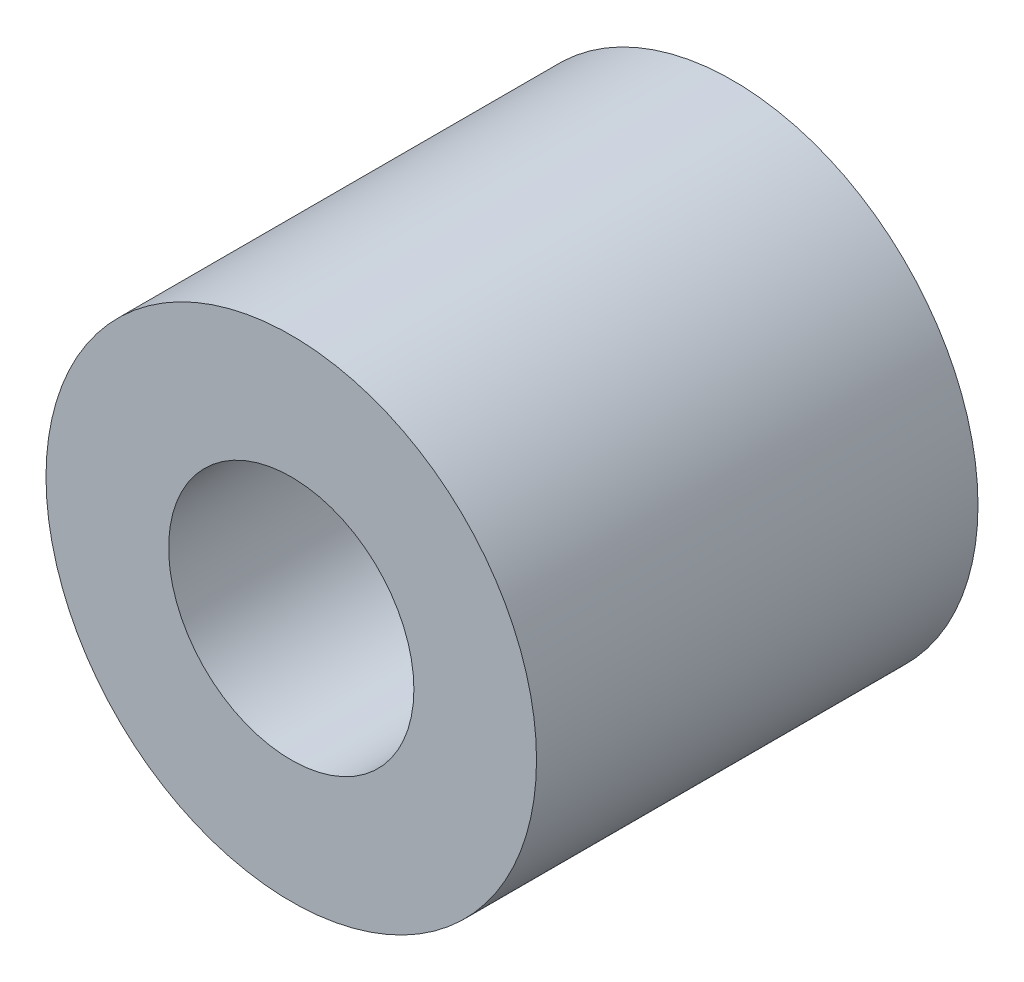
ISO-10303-21;
HEADER;
FILE_DESCRIPTION(('STEP AP214'),'2;1');
FILE_NAME('part.step','',(''),(''),'','','');
FILE_SCHEMA(('AUTOMOTIVE_DESIGN { 1 0 10303 214 1 1 1 1 }'));
ENDSEC;
DATA;
#1=APPLICATION_CONTEXT('core data for automotive mechanical design processes');
#2=APPLICATION_PROTOCOL_DEFINITION('international standard','automotive_design',2000,#1);
#3=PRODUCT_CONTEXT('',#1,'mechanical');
#4=PRODUCT('Part','Part','',(#3));
#5=PRODUCT_RELATED_PRODUCT_CATEGORY('part','',(#4));
#6=PRODUCT_DEFINITION_FORMATION('','',#4);
#7=PRODUCT_DEFINITION_CONTEXT('part definition',#1,'design');
#8=PRODUCT_DEFINITION('design','',#6,#7);
#9=PRODUCT_DEFINITION_SHAPE('','',#8);
#10=(LENGTH_UNIT() NAMED_UNIT(*) SI_UNIT(.MILLI.,.METRE.));
#11=(NAMED_UNIT(*) PLANE_ANGLE_UNIT() SI_UNIT($,.RADIAN.));
#12=(NAMED_UNIT(*) SI_UNIT($,.STERADIAN.) SOLID_ANGLE_UNIT());
#13=UNCERTAINTY_MEASURE_WITH_UNIT(LENGTH_MEASURE(1.E-05),#10,'distance_accuracy_value','');
#14=(GEOMETRIC_REPRESENTATION_CONTEXT(3) GLOBAL_UNCERTAINTY_ASSIGNED_CONTEXT((#13)) GLOBAL_UNIT_ASSIGNED_CONTEXT((#10,
#11,#12)) REPRESENTATION_CONTEXT('',''));
#15=CARTESIAN_POINT('',(0.,0.,0.));
#16=DIRECTION('',(0.,0.,1.));
#17=DIRECTION('',(1.,0.,0.));
#18=AXIS2_PLACEMENT_3D('',#15,#16,#17);
#19=CARTESIAN_POINT('',(0.,0.,9.));
#20=DIRECTION('',(0.,0.,1.));
#21=DIRECTION('',(1.,0.,0.));
#22=AXIS2_PLACEMENT_3D('',#19,#20,#21);
#23=PLANE('',#22);
#24=CARTESIAN_POINT('',(0.,0.,9.));
#25=DIRECTION('',(0.,0.,1.));
#26=DIRECTION('',(1.,0.,0.));
#27=AXIS2_PLACEMENT_3D('',#24,#25,#26);
#28=CIRCLE('',#27,5.);
#29=CARTESIAN_POINT('',(5.,0.,9.));
#30=VERTEX_POINT('',#29);
#31=EDGE_CURVE('E10',#30,#30,#28,.T.);
#32=ORIENTED_EDGE('',*,*,#31,.T.);
#33=EDGE_LOOP('',(#32));
#34=FACE_BOUND('',#33,.T.);
#35=CARTESIAN_POINT('',(0.,0.,9.));
#36=DIRECTION('',(0.,0.,1.));
#37=DIRECTION('',(1.,0.,0.));
#38=AXIS2_PLACEMENT_3D('',#35,#36,#37);
#39=CIRCLE('',#38,2.5);
#40=CARTESIAN_POINT('',(2.5,0.,9.));
#41=VERTEX_POINT('',#40);
#42=EDGE_CURVE('E48',#41,#41,#39,.T.);
#43=ORIENTED_EDGE('',*,*,#42,.F.);
#44=EDGE_LOOP('',(#43));
#45=FACE_BOUND('',#44,.T.);
#46=ADVANCED_FACE('F37',(#34,#45),#23,.T.);
#47=CARTESIAN_POINT('',(0.,0.,0.));
#48=DIRECTION('',(0.,0.,1.));
#49=DIRECTION('',(1.,0.,0.));
#50=AXIS2_PLACEMENT_3D('',#47,#48,#49);
#51=PLANE('',#50);
#52=CARTESIAN_POINT('',(0.,0.,0.));
#53=DIRECTION('',(0.,0.,1.));
#54=DIRECTION('',(1.,0.,0.));
#55=AXIS2_PLACEMENT_3D('',#52,#53,#54);
#56=CIRCLE('',#55,5.);
#57=CARTESIAN_POINT('',(5.,0.,0.));
#58=VERTEX_POINT('',#57);
#59=EDGE_CURVE('E41',#58,#58,#56,.T.);
#60=ORIENTED_EDGE('',*,*,#59,.F.);
#61=EDGE_LOOP('',(#60));
#62=FACE_BOUND('',#61,.T.);
#63=CARTESIAN_POINT('',(0.,0.,0.));
#64=DIRECTION('',(0.,0.,1.));
#65=DIRECTION('',(1.,0.,0.));
#66=AXIS2_PLACEMENT_3D('',#63,#64,#65);
#67=CIRCLE('',#66,2.5);
#68=CARTESIAN_POINT('',(2.5,0.,0.));
#69=VERTEX_POINT('',#68);
#70=EDGE_CURVE('E50',#69,#69,#67,.T.);
#71=ORIENTED_EDGE('',*,*,#70,.T.);
#72=EDGE_LOOP('',(#71));
#73=FACE_BOUND('',#72,.T.);
#74=ADVANCED_FACE('F60',(#62,#73),#51,.F.);
#75=CARTESIAN_POINT('',(0.,0.,9.));
#76=DIRECTION('',(0.,0.,-1.));
#77=DIRECTION('',(-1.,0.,0.));
#78=AXIS2_PLACEMENT_3D('',#75,#76,#77);
#79=CYLINDRICAL_SURFACE('',#78,5.);
#80=ORIENTED_EDGE('',*,*,#31,.F.);
#81=EDGE_LOOP('',(#80));
#82=FACE_BOUND('',#81,.T.);
#83=ORIENTED_EDGE('',*,*,#59,.T.);
#84=EDGE_LOOP('',(#83));
#85=FACE_BOUND('',#84,.T.);
#86=ADVANCED_FACE('F39',(#82,#85),#79,.T.);
#87=CARTESIAN_POINT('',(0.,0.,9.));
#88=DIRECTION('',(0.,0.,-1.));
#89=DIRECTION('',(-1.,0.,0.));
#90=AXIS2_PLACEMENT_3D('',#87,#88,#89);
#91=CYLINDRICAL_SURFACE('',#90,2.5);
#92=ORIENTED_EDGE('',*,*,#42,.T.);
#93=EDGE_LOOP('',(#92));
#94=FACE_BOUND('',#93,.T.);
#95=ORIENTED_EDGE('',*,*,#70,.F.);
#96=EDGE_LOOP('',(#95));
#97=FACE_BOUND('',#96,.T.);
#98=ADVANCED_FACE('F56',(#94,#97),#91,.F.);
#99=CLOSED_SHELL('',(#46,#74,#86,#98));
#100=MANIFOLD_SOLID_BREP('B2',#99);
#101=ADVANCED_BREP_SHAPE_REPRESENTATION('',(#18,#100),#14);
#102=SHAPE_DEFINITION_REPRESENTATION(#9,#101);
ENDSEC;
END-ISO-10303-21;
